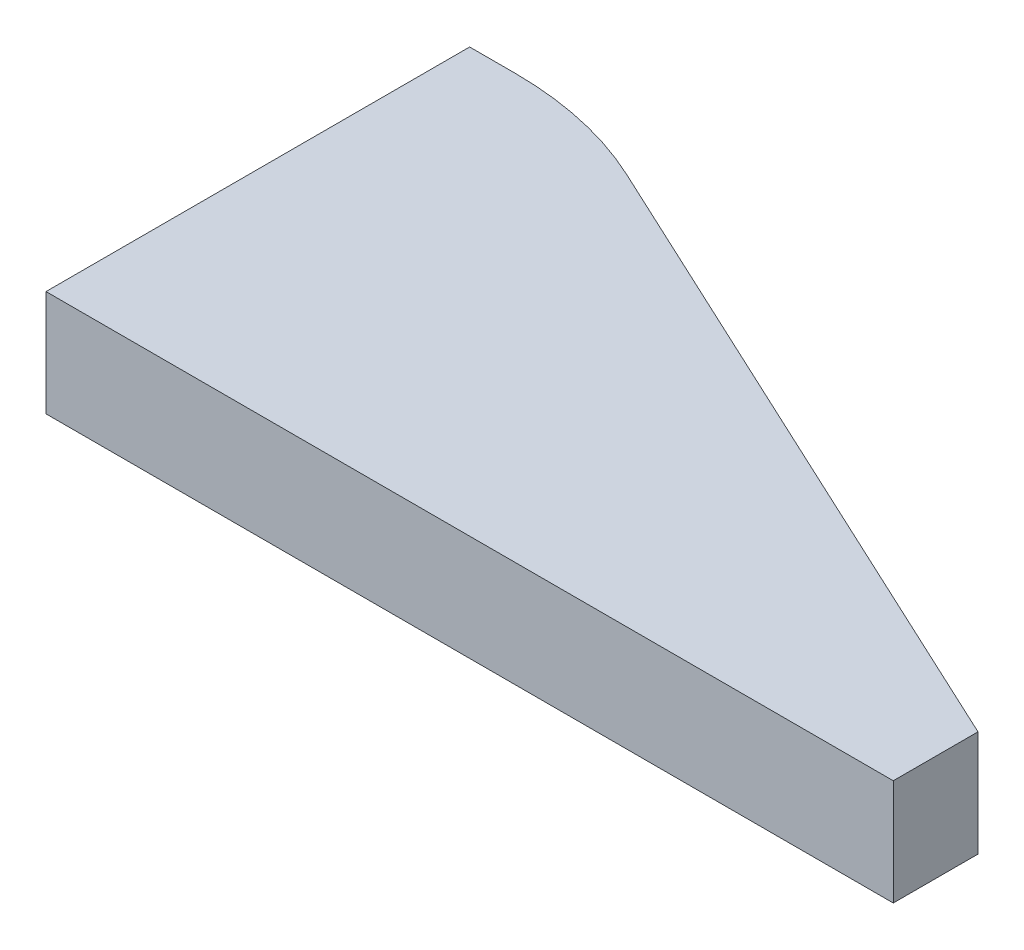
ISO-10303-21;
HEADER;
FILE_DESCRIPTION(('STEP AP214'),'2;1');
FILE_NAME('part.step','',(''),(''),'','','');
FILE_SCHEMA(('AUTOMOTIVE_DESIGN { 1 0 10303 214 1 1 1 1 }'));
ENDSEC;
DATA;
#1=APPLICATION_CONTEXT('core data for automotive mechanical design processes');
#2=APPLICATION_PROTOCOL_DEFINITION('international standard','automotive_design',2000,#1);
#3=PRODUCT_CONTEXT('',#1,'mechanical');
#4=PRODUCT('Part','Part','',(#3));
#5=PRODUCT_RELATED_PRODUCT_CATEGORY('part','',(#4));
#6=PRODUCT_DEFINITION_FORMATION('','',#4);
#7=PRODUCT_DEFINITION_CONTEXT('part definition',#1,'design');
#8=PRODUCT_DEFINITION('design','',#6,#7);
#9=PRODUCT_DEFINITION_SHAPE('','',#8);
#10=(LENGTH_UNIT() NAMED_UNIT(*) SI_UNIT(.MILLI.,.METRE.));
#11=(NAMED_UNIT(*) PLANE_ANGLE_UNIT() SI_UNIT($,.RADIAN.));
#12=(NAMED_UNIT(*) SI_UNIT($,.STERADIAN.) SOLID_ANGLE_UNIT());
#13=UNCERTAINTY_MEASURE_WITH_UNIT(LENGTH_MEASURE(1.E-05),#10,'distance_accuracy_value','');
#14=(GEOMETRIC_REPRESENTATION_CONTEXT(3) GLOBAL_UNCERTAINTY_ASSIGNED_CONTEXT((#13)) GLOBAL_UNIT_ASSIGNED_CONTEXT((#10,
#11,#12)) REPRESENTATION_CONTEXT('',''));
#15=CARTESIAN_POINT('',(0.,0.,0.));
#16=DIRECTION('',(0.,0.,1.));
#17=DIRECTION('',(1.,0.,0.));
#18=AXIS2_PLACEMENT_3D('',#15,#16,#17);
#19=CARTESIAN_POINT('',(0.,3.175,0.));
#20=DIRECTION('',(1.,0.,0.));
#21=DIRECTION('',(0.,0.,-1.));
#22=AXIS2_PLACEMENT_3D('',#19,#20,#21);
#23=PLANE('',#22);
#24=DIRECTION('',(0.,0.,1.));
#25=VECTOR('',#24,1.);
#26=CARTESIAN_POINT('',(0.,0.,0.));
#27=LINE('',#26,#25);
#28=CARTESIAN_POINT('',(0.,0.,-12.7));
#29=VERTEX_POINT('',#28);
#30=CARTESIAN_POINT('',(0.,0.,0.));
#31=VERTEX_POINT('',#30);
#32=EDGE_CURVE('E117',#29,#31,#27,.T.);
#33=ORIENTED_EDGE('',*,*,#32,.T.);
#34=DIRECTION('',(0.,-1.,0.));
#35=VECTOR('',#34,1.);
#36=CARTESIAN_POINT('',(0.,3.175,0.));
#37=LINE('',#36,#35);
#38=CARTESIAN_POINT('',(0.,3.175,0.));
#39=VERTEX_POINT('',#38);
#40=EDGE_CURVE('E97',#39,#31,#37,.T.);
#41=ORIENTED_EDGE('',*,*,#40,.F.);
#42=DIRECTION('',(0.,0.,1.));
#43=VECTOR('',#42,1.);
#44=CARTESIAN_POINT('',(0.,3.175,0.));
#45=LINE('',#44,#43);
#46=CARTESIAN_POINT('',(0.,3.175,-12.7));
#47=VERTEX_POINT('',#46);
#48=EDGE_CURVE('E105',#47,#39,#45,.T.);
#49=ORIENTED_EDGE('',*,*,#48,.F.);
#50=DIRECTION('',(0.,-1.,0.));
#51=VECTOR('',#50,1.);
#52=CARTESIAN_POINT('',(0.,3.175,-12.7));
#53=LINE('',#52,#51);
#54=EDGE_CURVE('E122',#47,#29,#53,.T.);
#55=ORIENTED_EDGE('',*,*,#54,.T.);
#56=EDGE_LOOP('',(#33,#41,#49,#55));
#57=FACE_BOUND('',#56,.T.);
#58=ADVANCED_FACE('F41',(#57),#23,.F.);
#59=CARTESIAN_POINT('',(0.,3.175,0.));
#60=DIRECTION('',(0.,0.,-1.));
#61=DIRECTION('',(-1.,0.,0.));
#62=AXIS2_PLACEMENT_3D('',#59,#60,#61);
#63=PLANE('',#62);
#64=DIRECTION('',(1.,0.,0.));
#65=VECTOR('',#64,1.);
#66=CARTESIAN_POINT('',(0.,0.,0.));
#67=LINE('',#66,#65);
#68=CARTESIAN_POINT('',(25.4,0.,0.));
#69=VERTEX_POINT('',#68);
#70=EDGE_CURVE('E141',#31,#69,#67,.T.);
#71=ORIENTED_EDGE('',*,*,#70,.T.);
#72=DIRECTION('',(0.,-1.,0.));
#73=VECTOR('',#72,1.);
#74=CARTESIAN_POINT('',(25.4,3.175,0.));
#75=LINE('',#74,#73);
#76=CARTESIAN_POINT('',(25.4,3.175,0.));
#77=VERTEX_POINT('',#76);
#78=EDGE_CURVE('E100',#77,#69,#75,.T.);
#79=ORIENTED_EDGE('',*,*,#78,.F.);
#80=DIRECTION('',(1.,0.,0.));
#81=VECTOR('',#80,1.);
#82=CARTESIAN_POINT('',(0.,3.175,0.));
#83=LINE('',#82,#81);
#84=EDGE_CURVE('E93',#39,#77,#83,.T.);
#85=ORIENTED_EDGE('',*,*,#84,.F.);
#86=ORIENTED_EDGE('',*,*,#40,.T.);
#87=EDGE_LOOP('',(#71,#79,#85,#86));
#88=FACE_BOUND('',#87,.T.);
#89=ADVANCED_FACE('F95',(#88),#63,.F.);
#90=CARTESIAN_POINT('',(25.4,3.175,0.));
#91=DIRECTION('',(-1.,0.,0.));
#92=DIRECTION('',(0.,0.,1.));
#93=AXIS2_PLACEMENT_3D('',#90,#91,#92);
#94=PLANE('',#93);
#95=DIRECTION('',(0.,0.,-1.));
#96=VECTOR('',#95,1.);
#97=CARTESIAN_POINT('',(25.4,0.,0.));
#98=LINE('',#97,#96);
#99=CARTESIAN_POINT('',(25.4,0.,-2.53999999999998));
#100=VERTEX_POINT('',#99);
#101=EDGE_CURVE('E138',#69,#100,#98,.T.);
#102=ORIENTED_EDGE('',*,*,#101,.T.);
#103=DIRECTION('',(0.,1.,0.));
#104=VECTOR('',#103,1.);
#105=CARTESIAN_POINT('',(25.4,3.175,-2.53999999999998));
#106=LINE('',#105,#104);
#107=CARTESIAN_POINT('',(25.4,3.175,-2.53999999999998));
#108=VERTEX_POINT('',#107);
#109=EDGE_CURVE('E120',#100,#108,#106,.T.);
#110=ORIENTED_EDGE('',*,*,#109,.T.);
#111=DIRECTION('',(0.,0.,-1.));
#112=VECTOR('',#111,1.);
#113=CARTESIAN_POINT('',(25.4,3.175,0.));
#114=LINE('',#113,#112);
#115=EDGE_CURVE('E104',#77,#108,#114,.T.);
#116=ORIENTED_EDGE('',*,*,#115,.F.);
#117=ORIENTED_EDGE('',*,*,#78,.T.);
#118=EDGE_LOOP('',(#102,#110,#116,#117));
#119=FACE_BOUND('',#118,.T.);
#120=ADVANCED_FACE('F149',(#119),#94,.F.);
#121=CARTESIAN_POINT('',(0.,3.175,-12.7));
#122=DIRECTION('',(0.,0.,1.));
#123=DIRECTION('',(1.,0.,0.));
#124=AXIS2_PLACEMENT_3D('',#121,#122,#123);
#125=PLANE('',#124);
#126=DIRECTION('',(-1.,0.,0.));
#127=VECTOR('',#126,1.);
#128=CARTESIAN_POINT('',(0.,3.175,-12.7));
#129=LINE('',#128,#127);
#130=CARTESIAN_POINT('',(1.35939191517063,3.175,-12.7));
#131=VERTEX_POINT('',#130);
#132=EDGE_CURVE('E110',#131,#47,#129,.T.);
#133=ORIENTED_EDGE('',*,*,#132,.F.);
#134=DIRECTION('',(0.,1.,0.));
#135=VECTOR('',#134,1.);
#136=CARTESIAN_POINT('',(1.35939191517063,0.,-12.7));
#137=LINE('',#136,#135);
#138=CARTESIAN_POINT('',(1.35939191517063,0.,-12.7));
#139=VERTEX_POINT('',#138);
#140=EDGE_CURVE('E129',#131,#139,#137,.F.);
#141=ORIENTED_EDGE('',*,*,#140,.T.);
#142=DIRECTION('',(-1.,0.,0.));
#143=VECTOR('',#142,1.);
#144=CARTESIAN_POINT('',(0.,0.,-12.7));
#145=LINE('',#144,#143);
#146=EDGE_CURVE('E114',#139,#29,#145,.T.);
#147=ORIENTED_EDGE('',*,*,#146,.T.);
#148=ORIENTED_EDGE('',*,*,#54,.F.);
#149=EDGE_LOOP('',(#133,#141,#147,#148));
#150=FACE_BOUND('',#149,.T.);
#151=ADVANCED_FACE('F134',(#150),#125,.F.);
#152=CARTESIAN_POINT('',(0.,3.175,0.));
#153=DIRECTION('',(0.,-1.,0.));
#154=DIRECTION('',(0.,0.,-1.));
#155=AXIS2_PLACEMENT_3D('',#152,#153,#154);
#156=PLANE('',#155);
#157=DIRECTION('',(0.906307787036649,0.,0.4226182617407));
#158=VECTOR('',#157,1.);
#159=CARTESIAN_POINT('',(3.6118096876229,3.175,-12.7));
#160=LINE('',#159,#158);
#161=CARTESIAN_POINT('',(5.65319345445614,3.175,-11.7480871162924));
#162=VERTEX_POINT('',#161);
#163=EDGE_CURVE('E127',#108,#162,#160,.F.);
#164=ORIENTED_EDGE('',*,*,#163,.T.);
#165=CARTESIAN_POINT('',(1.35939191517063,3.175,-2.54));
#166=DIRECTION('',(0.,-1.,0.));
#167=DIRECTION('',(0.,0.,-1.));
#168=AXIS2_PLACEMENT_3D('',#165,#166,#167);
#169=CIRCLE('',#168,10.16);
#170=EDGE_CURVE('E11',#162,#131,#169,.F.);
#171=ORIENTED_EDGE('',*,*,#170,.T.);
#172=ORIENTED_EDGE('',*,*,#132,.T.);
#173=ORIENTED_EDGE('',*,*,#48,.T.);
#174=ORIENTED_EDGE('',*,*,#84,.T.);
#175=ORIENTED_EDGE('',*,*,#115,.T.);
#176=EDGE_LOOP('',(#164,#171,#172,#173,#174,#175));
#177=FACE_BOUND('',#176,.T.);
#178=ADVANCED_FACE('F108',(#177),#156,.F.);
#179=CARTESIAN_POINT('',(0.,0.,0.));
#180=DIRECTION('',(0.,-1.,0.));
#181=DIRECTION('',(0.,0.,-1.));
#182=AXIS2_PLACEMENT_3D('',#179,#180,#181);
#183=PLANE('',#182);
#184=ORIENTED_EDGE('',*,*,#146,.F.);
#185=CARTESIAN_POINT('',(1.35939191517063,0.,-2.54));
#186=DIRECTION('',(0.,-1.,0.));
#187=DIRECTION('',(0.,0.,-1.));
#188=AXIS2_PLACEMENT_3D('',#185,#186,#187);
#189=CIRCLE('',#188,10.16);
#190=CARTESIAN_POINT('',(5.65319345445614,0.,-11.7480871162924));
#191=VERTEX_POINT('',#190);
#192=EDGE_CURVE('E63',#139,#191,#189,.T.);
#193=ORIENTED_EDGE('',*,*,#192,.T.);
#194=DIRECTION('',(-0.906307787036649,0.,-0.4226182617407));
#195=VECTOR('',#194,1.);
#196=CARTESIAN_POINT('',(5.50947379974207,0.,-11.8151046919129));
#197=LINE('',#196,#195);
#198=EDGE_CURVE('E118',#191,#100,#197,.F.);
#199=ORIENTED_EDGE('',*,*,#198,.T.);
#200=ORIENTED_EDGE('',*,*,#101,.F.);
#201=ORIENTED_EDGE('',*,*,#70,.F.);
#202=ORIENTED_EDGE('',*,*,#32,.F.);
#203=EDGE_LOOP('',(#184,#193,#199,#200,#201,#202));
#204=FACE_BOUND('',#203,.T.);
#205=ADVANCED_FACE('F137',(#204),#183,.T.);
#206=CARTESIAN_POINT('',(3.6118096876229,3.175,-12.7));
#207=DIRECTION('',(-0.4226182617407,0.,0.906307787036649));
#208=DIRECTION('',(0.,-1.,0.));
#209=AXIS2_PLACEMENT_3D('',#206,#207,#208);
#210=PLANE('',#209);
#211=ORIENTED_EDGE('',*,*,#198,.F.);
#212=DIRECTION('',(0.,-1.,0.));
#213=VECTOR('',#212,1.);
#214=CARTESIAN_POINT('',(5.65319345445614,3.175,-11.7480871162924));
#215=LINE('',#214,#213);
#216=EDGE_CURVE('E49',#191,#162,#215,.F.);
#217=ORIENTED_EDGE('',*,*,#216,.T.);
#218=ORIENTED_EDGE('',*,*,#163,.F.);
#219=ORIENTED_EDGE('',*,*,#109,.F.);
#220=EDGE_LOOP('',(#211,#217,#218,#219));
#221=FACE_BOUND('',#220,.T.);
#222=ADVANCED_FACE('F151',(#221),#210,.F.);
#223=CARTESIAN_POINT('',(1.35939191517063,3.175,-2.54));
#224=DIRECTION('',(0.,-1.,0.));
#225=DIRECTION('',(0.,0.,-1.));
#226=AXIS2_PLACEMENT_3D('',#223,#224,#225);
#227=CYLINDRICAL_SURFACE('',#226,10.16);
#228=ORIENTED_EDGE('',*,*,#170,.F.);
#229=ORIENTED_EDGE('',*,*,#216,.F.);
#230=ORIENTED_EDGE('',*,*,#192,.F.);
#231=ORIENTED_EDGE('',*,*,#140,.F.);
#232=EDGE_LOOP('',(#228,#229,#230,#231));
#233=FACE_BOUND('',#232,.T.);
#234=ADVANCED_FACE('F43',(#233),#227,.T.);
#235=CLOSED_SHELL('',(#58,#89,#120,#151,#178,#205,#222,#234));
#236=MANIFOLD_SOLID_BREP('B2',#235);
#237=ADVANCED_BREP_SHAPE_REPRESENTATION('',(#18,#236),#14);
#238=SHAPE_DEFINITION_REPRESENTATION(#9,#237);
ENDSEC;
END-ISO-10303-21;
